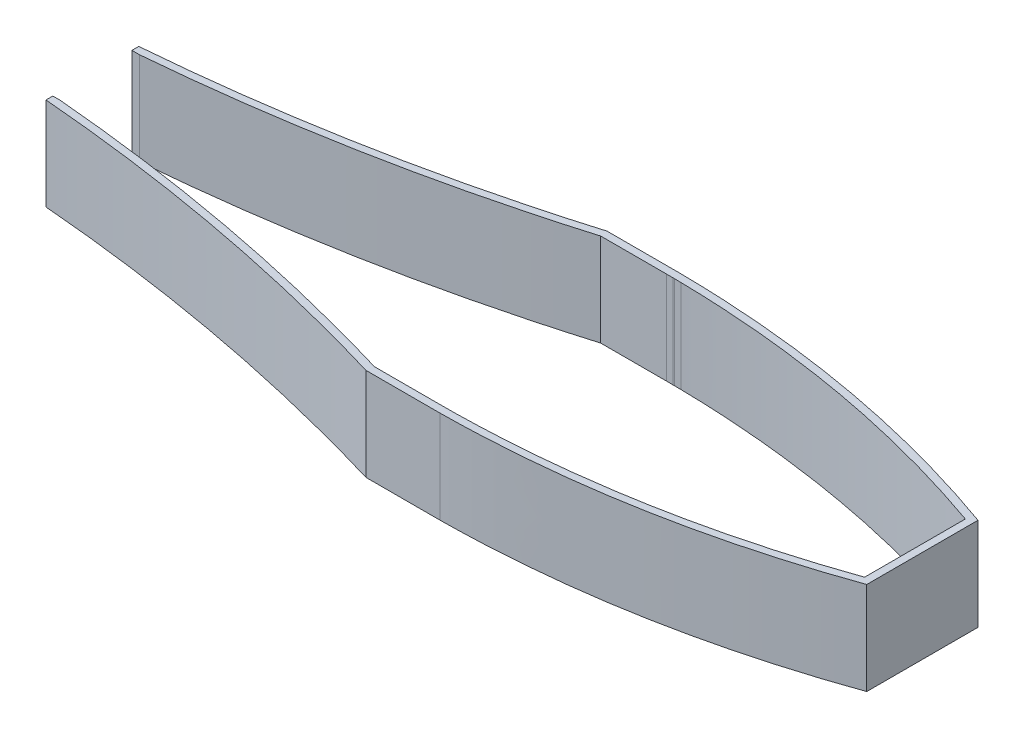
ISO-10303-21;
HEADER;
FILE_DESCRIPTION(('STEP AP214'),'2;1');
FILE_NAME('part.step','',(''),(''),'','','');
FILE_SCHEMA(('AUTOMOTIVE_DESIGN { 1 0 10303 214 1 1 1 1 }'));
ENDSEC;
DATA;
#1=APPLICATION_CONTEXT('core data for automotive mechanical design processes');
#2=APPLICATION_PROTOCOL_DEFINITION('international standard','automotive_design',2000,#1);
#3=PRODUCT_CONTEXT('',#1,'mechanical');
#4=PRODUCT('Part','Part','',(#3));
#5=PRODUCT_RELATED_PRODUCT_CATEGORY('part','',(#4));
#6=PRODUCT_DEFINITION_FORMATION('','',#4);
#7=PRODUCT_DEFINITION_CONTEXT('part definition',#1,'design');
#8=PRODUCT_DEFINITION('design','',#6,#7);
#9=PRODUCT_DEFINITION_SHAPE('','',#8);
#10=(LENGTH_UNIT() NAMED_UNIT(*) SI_UNIT(.MILLI.,.METRE.));
#11=(NAMED_UNIT(*) PLANE_ANGLE_UNIT() SI_UNIT($,.RADIAN.));
#12=(NAMED_UNIT(*) SI_UNIT($,.STERADIAN.) SOLID_ANGLE_UNIT());
#13=UNCERTAINTY_MEASURE_WITH_UNIT(LENGTH_MEASURE(1.E-05),#10,'distance_accuracy_value','');
#14=(GEOMETRIC_REPRESENTATION_CONTEXT(3) GLOBAL_UNCERTAINTY_ASSIGNED_CONTEXT((#13)) GLOBAL_UNIT_ASSIGNED_CONTEXT((#10,
#11,#12)) REPRESENTATION_CONTEXT('',''));
#15=CARTESIAN_POINT('',(0.,0.,0.));
#16=DIRECTION('',(0.,0.,1.));
#17=DIRECTION('',(1.,0.,0.));
#18=AXIS2_PLACEMENT_3D('',#15,#16,#17);
#19=CARTESIAN_POINT('',(-126.25,-12.5,0.));
#20=DIRECTION('',(1.,0.,0.));
#21=DIRECTION('',(0.,0.,-1.));
#22=AXIS2_PLACEMENT_3D('',#19,#20,#21);
#23=PLANE('',#22);
#24=DIRECTION('',(0.,0.,-1.));
#25=VECTOR('',#24,1.);
#26=CARTESIAN_POINT('',(-126.25,-12.5,0.));
#27=LINE('',#26,#25);
#28=CARTESIAN_POINT('',(-126.25,-12.5,-10.6620215750274));
#29=VERTEX_POINT('',#28);
#30=CARTESIAN_POINT('',(-126.25,-12.5,-12.5));
#31=VERTEX_POINT('',#30);
#32=EDGE_CURVE('E217',#29,#31,#27,.T.);
#33=ORIENTED_EDGE('',*,*,#32,.F.);
#34=DIRECTION('',(0.,1.,0.));
#35=VECTOR('',#34,1.);
#36=CARTESIAN_POINT('',(-126.25,-12.5,-10.6620215750274));
#37=LINE('',#36,#35);
#38=CARTESIAN_POINT('',(-126.25,12.5,-10.6620215750274));
#39=VERTEX_POINT('',#38);
#40=EDGE_CURVE('E201',#29,#39,#37,.T.);
#41=ORIENTED_EDGE('',*,*,#40,.T.);
#42=DIRECTION('',(0.,0.,-1.));
#43=VECTOR('',#42,1.);
#44=CARTESIAN_POINT('',(-126.25,12.5,0.));
#45=LINE('',#44,#43);
#46=CARTESIAN_POINT('',(-126.25,12.5,-12.5));
#47=VERTEX_POINT('',#46);
#48=EDGE_CURVE('E437',#39,#47,#45,.T.);
#49=ORIENTED_EDGE('',*,*,#48,.T.);
#50=DIRECTION('',(0.,1.,0.));
#51=VECTOR('',#50,1.);
#52=CARTESIAN_POINT('',(-126.25,-12.5,-12.5));
#53=LINE('',#52,#51);
#54=EDGE_CURVE('E224',#31,#47,#53,.T.);
#55=ORIENTED_EDGE('',*,*,#54,.F.);
#56=EDGE_LOOP('',(#33,#41,#49,#55));
#57=FACE_BOUND('',#56,.T.);
#58=ADVANCED_FACE('F35',(#57),#23,.F.);
#59=CARTESIAN_POINT('',(0.,12.5,0.));
#60=DIRECTION('',(0.,1.,0.));
#61=DIRECTION('',(0.,0.,1.));
#62=AXIS2_PLACEMENT_3D('',#59,#60,#61);
#63=PLANE('',#62);
#64=DIRECTION('',(-1.,0.,0.));
#65=VECTOR('',#64,1.);
#66=CARTESIAN_POINT('',(-126.25,12.5,-10.6620215750274));
#67=LINE('',#66,#65);
#68=CARTESIAN_POINT('',(-124.25,12.5,-10.6620215750274));
#69=VERTEX_POINT('',#68);
#70=EDGE_CURVE('E207',#69,#39,#67,.T.);
#71=ORIENTED_EDGE('',*,*,#70,.F.);
#72=CARTESIAN_POINT('',(-124.25,12.5,-10.6620215750274));
#73=CARTESIAN_POINT('',(-115.390155067907,12.5,-11.4268576003619));
#74=CARTESIAN_POINT('',(-97.6864852297956,12.5,-13.4055449764967));
#75=CARTESIAN_POINT('',(-71.4331214223826,12.5,-17.7000760163041));
#76=CARTESIAN_POINT('',(-45.4314100475332,12.5,-23.3215801554135));
#77=CARTESIAN_POINT('',(-28.2330739267644,12.5,-27.9659837794386));
#78=CARTESIAN_POINT('',(-19.7087432440609,12.5,-30.5000000000002));
#79=B_SPLINE_CURVE_WITH_KNOTS('',3,(#72,#73,#74,#75,#76,#77,#78),.UNSPECIFIED.,.F.,.F.,(4,1,1,1,
4),(0.0168781100863478,0.261989852456643,0.507101594826939,0.752213337197234,0.997325079567529),.UNSPECIFIED.);
#80=CARTESIAN_POINT('',(-19.7087432440609,12.5,-30.5000000000002));
#81=VERTEX_POINT('',#80);
#82=EDGE_CURVE('E444',#69,#81,#79,.T.);
#83=ORIENTED_EDGE('',*,*,#82,.T.);
#84=DIRECTION('',(-1.,0.,0.));
#85=VECTOR('',#84,1.);
#86=CARTESIAN_POINT('',(2.62920849060436E-13,12.5,-30.5));
#87=LINE('',#86,#85);
#88=CARTESIAN_POINT('',(-2.,12.5,-30.5));
#89=VERTEX_POINT('',#88);
#90=EDGE_CURVE('E321',#89,#81,#87,.T.);
#91=ORIENTED_EDGE('',*,*,#90,.F.);
#92=DIRECTION('',(-0.999975816566454,0.,-0.00695458713752587));
#93=VECTOR('',#92,1.);
#94=CARTESIAN_POINT('',(2.,12.5,-30.4721809786904));
#95=LINE('',#94,#93);
#96=CARTESIAN_POINT('',(-0.193723572850844,12.5,-30.4874377893955));
#97=VERTEX_POINT('',#96);
#98=EDGE_CURVE('E462',#97,#89,#95,.T.);
#99=ORIENTED_EDGE('',*,*,#98,.F.);
#100=CARTESIAN_POINT('',(0.,12.5,-29.));
#101=DIRECTION('',(0.,1.,0.));
#102=DIRECTION('',(0.,0.,1.));
#103=AXIS2_PLACEMENT_3D('',#100,#101,#102);
#104=CIRCLE('',#103,1.5);
#105=CARTESIAN_POINT('',(0.21439336457702,12.5,-30.4845994359508));
#106=VERTEX_POINT('',#105);
#107=EDGE_CURVE('E329',#106,#97,#104,.T.);
#108=ORIENTED_EDGE('',*,*,#107,.F.);
#109=CARTESIAN_POINT('',(2.,12.5,-30.4721809786904));
#110=VERTEX_POINT('',#109);
#111=EDGE_CURVE('E478',#110,#106,#95,.T.);
#112=ORIENTED_EDGE('',*,*,#111,.F.);
#113=CARTESIAN_POINT('',(95.5,12.5,-13.5862789648943));
#114=CARTESIAN_POINT('',(91.704019985039,12.5,-14.9201112795228));
#115=CARTESIAN_POINT('',(84.0400355662773,12.5,-17.4466985186937));
#116=CARTESIAN_POINT('',(68.6811540351843,12.5,-21.8452889926134));
#117=CARTESIAN_POINT('',(49.3064036307917,12.5,-26.1584186743587));
#118=CARTESIAN_POINT('',(29.7202596468768,12.5,-28.8815162857712));
#119=CARTESIAN_POINT('',(13.9286149772672,12.5,-30.1079164427287));
#120=CARTESIAN_POINT('',(5.97342158088553,12.5,-30.4038510627313));
#121=CARTESIAN_POINT('',(2.,12.5,-30.4721809786904));
#122=B_SPLINE_CURVE_WITH_KNOTS('',3,(#113,#114,#115,#116,#117,#118,#119,#120,#121),
.UNSPECIFIED.,.F.,.F.,(4,1,1,1,1,1,4),(0.0140296538795126,0.13472502987988,0.255420405880247,
0.496811157880981,0.738201909881715,0.858897285882082,0.979592661882449),.UNSPECIFIED.);
#123=CARTESIAN_POINT('',(95.5,12.5,-13.5862789648943));
#124=VERTEX_POINT('',#123);
#125=EDGE_CURVE('E288',#124,#110,#122,.T.);
#126=ORIENTED_EDGE('',*,*,#125,.F.);
#127=DIRECTION('',(0.,0.,-1.));
#128=VECTOR('',#127,1.);
#129=CARTESIAN_POINT('',(95.5,12.5,0.));
#130=LINE('',#129,#128);
#131=CARTESIAN_POINT('',(95.5,12.5,13.5862789648943));
#132=VERTEX_POINT('',#131);
#133=EDGE_CURVE('E295',#132,#124,#130,.T.);
#134=ORIENTED_EDGE('',*,*,#133,.F.);
#135=CARTESIAN_POINT('',(95.5,12.5,13.5862789648943));
#136=CARTESIAN_POINT('',(91.704019985039,12.5,14.9201112795228));
#137=CARTESIAN_POINT('',(84.0400355662773,12.5,17.4466985186937));
#138=CARTESIAN_POINT('',(68.6811540351843,12.5,21.8452889926134));
#139=CARTESIAN_POINT('',(49.3064036307917,12.5,26.1584186743587));
#140=CARTESIAN_POINT('',(29.7202596468768,12.5,28.8815162857712));
#141=CARTESIAN_POINT('',(13.9286149772672,12.5,30.1079164427287));
#142=CARTESIAN_POINT('',(5.97342158088553,12.5,30.4038510627313));
#143=CARTESIAN_POINT('',(2.,12.5,30.4721809786904));
#144=B_SPLINE_CURVE_WITH_KNOTS('',3,(#135,#136,#137,#138,#139,#140,#141,#142,#143),
.UNSPECIFIED.,.F.,.F.,(4,1,1,1,1,1,4),(0.0140296538795126,0.13472502987988,0.255420405880247,
0.496811157880981,0.738201909881715,0.858897285882082,0.979592661882449),.UNSPECIFIED.);
#145=CARTESIAN_POINT('',(2.,12.5,30.4721809786904));
#146=VERTEX_POINT('',#145);
#147=EDGE_CURVE('E414',#132,#146,#144,.T.);
#148=ORIENTED_EDGE('',*,*,#147,.T.);
#149=DIRECTION('',(-0.999975816566454,0.,0.00695458713752587));
#150=VECTOR('',#149,1.);
#151=CARTESIAN_POINT('',(2.,12.5,30.4721809786904));
#152=LINE('',#151,#150);
#153=CARTESIAN_POINT('',(0.,12.5,30.4860904893452));
#154=VERTEX_POINT('',#153);
#155=EDGE_CURVE('E664',#146,#154,#152,.T.);
#156=ORIENTED_EDGE('',*,*,#155,.T.);
#157=DIRECTION('',(0.,0.,1.));
#158=VECTOR('',#157,1.);
#159=CARTESIAN_POINT('',(0.,12.5,0.));
#160=LINE('',#159,#158);
#161=CARTESIAN_POINT('',(0.,12.5,30.5));
#162=VERTEX_POINT('',#161);
#163=EDGE_CURVE('E397',#154,#162,#160,.T.);
#164=ORIENTED_EDGE('',*,*,#163,.T.);
#165=CARTESIAN_POINT('',(0.,12.5,29.));
#166=DIRECTION('',(0.,-1.,0.));
#167=DIRECTION('',(0.,0.,-1.));
#168=AXIS2_PLACEMENT_3D('',#165,#166,#167);
#169=CIRCLE('',#168,1.5);
#170=CARTESIAN_POINT('',(-0.193723572850844,12.5,30.4874377893955));
#171=VERTEX_POINT('',#170);
#172=EDGE_CURVE('E493',#162,#171,#169,.T.);
#173=ORIENTED_EDGE('',*,*,#172,.T.);
#174=CARTESIAN_POINT('',(-2.,12.5,30.5));
#175=VERTEX_POINT('',#174);
#176=EDGE_CURVE('E59',#171,#175,#152,.T.);
#177=ORIENTED_EDGE('',*,*,#176,.T.);
#178=DIRECTION('',(-1.,0.,0.));
#179=VECTOR('',#178,1.);
#180=CARTESIAN_POINT('',(2.62920849060436E-13,12.5,30.5));
#181=LINE('',#180,#179);
#182=CARTESIAN_POINT('',(-19.7087432440609,12.5,30.5000000000002));
#183=VERTEX_POINT('',#182);
#184=EDGE_CURVE('E501',#175,#183,#181,.T.);
#185=ORIENTED_EDGE('',*,*,#184,.T.);
#186=CARTESIAN_POINT('',(-124.25,12.5,10.6620215750274));
#187=CARTESIAN_POINT('',(-115.390155067907,12.5,11.4268576003619));
#188=CARTESIAN_POINT('',(-97.6864852297956,12.5,13.4055449764967));
#189=CARTESIAN_POINT('',(-71.4331214223826,12.5,17.7000760163041));
#190=CARTESIAN_POINT('',(-45.4314100475332,12.5,23.3215801554135));
#191=CARTESIAN_POINT('',(-28.2330739267644,12.5,27.9659837794386));
#192=CARTESIAN_POINT('',(-19.7087432440609,12.5,30.5000000000002));
#193=B_SPLINE_CURVE_WITH_KNOTS('',3,(#186,#187,#188,#189,#190,#191,#192),.UNSPECIFIED.,.F.,.F.,
(4,1,1,1,4),(0.0168781100863478,0.261989852456643,0.507101594826939,0.752213337197234,
0.997325079567529),.UNSPECIFIED.);
#194=CARTESIAN_POINT('',(-124.25,12.5,10.6620215750274));
#195=VERTEX_POINT('',#194);
#196=EDGE_CURVE('E507',#195,#183,#193,.T.);
#197=ORIENTED_EDGE('',*,*,#196,.F.);
#198=DIRECTION('',(1.,0.,0.));
#199=VECTOR('',#198,1.);
#200=CARTESIAN_POINT('',(-124.25,12.5,10.6620215750274));
#201=LINE('',#200,#199);
#202=CARTESIAN_POINT('',(-126.25,12.5,10.6620215750274));
#203=VERTEX_POINT('',#202);
#204=EDGE_CURVE('E221',#203,#195,#201,.T.);
#205=ORIENTED_EDGE('',*,*,#204,.F.);
#206=CARTESIAN_POINT('',(-126.25,12.5,12.5));
#207=VERTEX_POINT('',#206);
#208=EDGE_CURVE('E438',#207,#203,#45,.T.);
#209=ORIENTED_EDGE('',*,*,#208,.F.);
#210=CARTESIAN_POINT('',(-126.25,12.5,12.5));
#211=CARTESIAN_POINT('',(-72.079745638654,12.5,16.9871695741156));
#212=CARTESIAN_POINT('',(-20.,12.5,32.5));
#213=B_SPLINE_CURVE_WITH_KNOTS('',2,(#210,#211,#212),.UNSPECIFIED.,.F.,.F.,(3,3),(0.,1.),.UNSPECIFIED.);
#214=CARTESIAN_POINT('',(-20.,12.5,32.5));
#215=VERTEX_POINT('',#214);
#216=EDGE_CURVE('E496',#207,#215,#213,.T.);
#217=ORIENTED_EDGE('',*,*,#216,.T.);
#218=DIRECTION('',(-1.,0.,0.));
#219=VECTOR('',#218,1.);
#220=CARTESIAN_POINT('',(0.,12.5,32.5));
#221=LINE('',#220,#219);
#222=CARTESIAN_POINT('',(0.,12.5,32.5));
#223=VERTEX_POINT('',#222);
#224=EDGE_CURVE('E490',#223,#215,#221,.T.);
#225=ORIENTED_EDGE('',*,*,#224,.F.);
#226=CARTESIAN_POINT('',(97.5,12.5,15.));
#227=CARTESIAN_POINT('',(49.8673330339721,12.5,31.9790963482648));
#228=CARTESIAN_POINT('',(0.,12.5,32.5));
#229=B_SPLINE_CURVE_WITH_KNOTS('',2,(#226,#227,#228),.UNSPECIFIED.,.F.,.F.,(3,3),(0.,1.),.UNSPECIFIED.);
#230=CARTESIAN_POINT('',(97.5,12.5,15.));
#231=VERTEX_POINT('',#230);
#232=EDGE_CURVE('E356',#231,#223,#229,.T.);
#233=ORIENTED_EDGE('',*,*,#232,.F.);
#234=DIRECTION('',(0.,0.,-1.));
#235=VECTOR('',#234,1.);
#236=CARTESIAN_POINT('',(97.5,12.5,0.));
#237=LINE('',#236,#235);
#238=CARTESIAN_POINT('',(97.5,12.5,-15.));
#239=VERTEX_POINT('',#238);
#240=EDGE_CURVE('E296',#231,#239,#237,.T.);
#241=ORIENTED_EDGE('',*,*,#240,.T.);
#242=CARTESIAN_POINT('',(97.5,12.5,-15.));
#243=CARTESIAN_POINT('',(49.8673330339721,12.5,-31.9790963482648));
#244=CARTESIAN_POINT('',(0.,12.5,-32.5));
#245=B_SPLINE_CURVE_WITH_KNOTS('',2,(#242,#243,#244),.UNSPECIFIED.,.F.,.F.,(3,3),(0.,1.),.UNSPECIFIED.);
#246=CARTESIAN_POINT('',(0.,12.5,-32.5));
#247=VERTEX_POINT('',#246);
#248=EDGE_CURVE('E347',#239,#247,#245,.T.);
#249=ORIENTED_EDGE('',*,*,#248,.T.);
#250=DIRECTION('',(-1.,0.,0.));
#251=VECTOR('',#250,1.);
#252=CARTESIAN_POINT('',(0.,12.5,-32.5));
#253=LINE('',#252,#251);
#254=CARTESIAN_POINT('',(-20.,12.5,-32.5));
#255=VERTEX_POINT('',#254);
#256=EDGE_CURVE('E312',#247,#255,#253,.T.);
#257=ORIENTED_EDGE('',*,*,#256,.T.);
#258=CARTESIAN_POINT('',(-126.25,12.5,-12.5));
#259=CARTESIAN_POINT('',(-72.079745638654,12.5,-16.9871695741156));
#260=CARTESIAN_POINT('',(-20.,12.5,-32.5));
#261=B_SPLINE_CURVE_WITH_KNOTS('',2,(#258,#259,#260),.UNSPECIFIED.,.F.,.F.,(3,3),(0.,1.),.UNSPECIFIED.);
#262=EDGE_CURVE('E432',#47,#255,#261,.T.);
#263=ORIENTED_EDGE('',*,*,#262,.F.);
#264=ORIENTED_EDGE('',*,*,#48,.F.);
#265=EDGE_LOOP('',(#71,#83,#91,#99,#108,#112,#126,#134,#148,#156,#164,#173,#177,#185,#197,#205,
#209,#217,#225,#233,#241,#249,#257,#263,#264));
#266=FACE_BOUND('',#265,.T.);
#267=ADVANCED_FACE('F275',(#266),#63,.T.);
#268=CARTESIAN_POINT('',(0.,-12.5,0.));
#269=DIRECTION('',(0.,1.,0.));
#270=DIRECTION('',(0.,0.,1.));
#271=AXIS2_PLACEMENT_3D('',#268,#269,#270);
#272=PLANE('',#271);
#273=CARTESIAN_POINT('',(-124.25,-12.5,-10.6620215750274));
#274=CARTESIAN_POINT('',(-115.390155067907,-12.5,-11.4268576003619));
#275=CARTESIAN_POINT('',(-97.6864852297956,-12.5,-13.4055449764967));
#276=CARTESIAN_POINT('',(-71.4331214223826,-12.5,-17.7000760163041));
#277=CARTESIAN_POINT('',(-45.4314100475332,-12.5,-23.3215801554135));
#278=CARTESIAN_POINT('',(-28.2330739267644,-12.5,-27.9659837794386));
#279=CARTESIAN_POINT('',(-19.7087432440609,-12.5,-30.5000000000002));
#280=B_SPLINE_CURVE_WITH_KNOTS('',3,(#273,#274,#275,#276,#277,#278,#279),.UNSPECIFIED.,.F.,.F.,
(4,1,1,1,4),(0.0168781100863478,0.261989852456643,0.507101594826939,0.752213337197234,
0.997325079567529),.UNSPECIFIED.);
#281=CARTESIAN_POINT('',(-124.25,-12.5,-10.6620215750274));
#282=VERTEX_POINT('',#281);
#283=CARTESIAN_POINT('',(-19.7087432440609,-12.5,-30.5000000000002));
#284=VERTEX_POINT('',#283);
#285=EDGE_CURVE('E220',#282,#284,#280,.T.);
#286=ORIENTED_EDGE('',*,*,#285,.F.);
#287=DIRECTION('',(-1.,0.,0.));
#288=VECTOR('',#287,1.);
#289=CARTESIAN_POINT('',(-126.25,-12.5,-10.6620215750274));
#290=LINE('',#289,#288);
#291=EDGE_CURVE('E204',#282,#29,#290,.T.);
#292=ORIENTED_EDGE('',*,*,#291,.T.);
#293=ORIENTED_EDGE('',*,*,#32,.T.);
#294=CARTESIAN_POINT('',(-126.25,-12.5,-12.5));
#295=CARTESIAN_POINT('',(-72.079745638654,-12.5,-16.9871695741156));
#296=CARTESIAN_POINT('',(-20.,-12.5,-32.5));
#297=B_SPLINE_CURVE_WITH_KNOTS('',2,(#294,#295,#296),.UNSPECIFIED.,.F.,.F.,(3,3),(0.,1.),.UNSPECIFIED.);
#298=CARTESIAN_POINT('',(-20.,-12.5,-32.5));
#299=VERTEX_POINT('',#298);
#300=EDGE_CURVE('E227',#31,#299,#297,.T.);
#301=ORIENTED_EDGE('',*,*,#300,.T.);
#302=DIRECTION('',(-1.,0.,0.));
#303=VECTOR('',#302,1.);
#304=CARTESIAN_POINT('',(0.,-12.5,-32.5));
#305=LINE('',#304,#303);
#306=CARTESIAN_POINT('',(0.,-12.5,-32.5));
#307=VERTEX_POINT('',#306);
#308=EDGE_CURVE('E230',#307,#299,#305,.T.);
#309=ORIENTED_EDGE('',*,*,#308,.F.);
#310=CARTESIAN_POINT('',(97.5,-12.5,-15.));
#311=CARTESIAN_POINT('',(49.8673330339721,-12.5,-31.9790963482648));
#312=CARTESIAN_POINT('',(0.,-12.5,-32.5));
#313=B_SPLINE_CURVE_WITH_KNOTS('',2,(#310,#311,#312),.UNSPECIFIED.,.F.,.F.,(3,3),(0.,1.),.UNSPECIFIED.);
#314=CARTESIAN_POINT('',(97.5,-12.5,-15.));
#315=VERTEX_POINT('',#314);
#316=EDGE_CURVE('E318',#315,#307,#313,.T.);
#317=ORIENTED_EDGE('',*,*,#316,.F.);
#318=DIRECTION('',(0.,0.,-1.));
#319=VECTOR('',#318,1.);
#320=CARTESIAN_POINT('',(97.5,-12.5,0.));
#321=LINE('',#320,#319);
#322=CARTESIAN_POINT('',(97.5,-12.5,15.));
#323=VERTEX_POINT('',#322);
#324=EDGE_CURVE('E323',#323,#315,#321,.T.);
#325=ORIENTED_EDGE('',*,*,#324,.F.);
#326=CARTESIAN_POINT('',(97.5,-12.5,15.));
#327=CARTESIAN_POINT('',(49.8673330339721,-12.5,31.9790963482648));
#328=CARTESIAN_POINT('',(0.,-12.5,32.5));
#329=B_SPLINE_CURVE_WITH_KNOTS('',2,(#326,#327,#328),.UNSPECIFIED.,.F.,.F.,(3,3),(0.,1.),.UNSPECIFIED.);
#330=CARTESIAN_POINT('',(0.,-12.5,32.5));
#331=VERTEX_POINT('',#330);
#332=EDGE_CURVE('E363',#323,#331,#329,.T.);
#333=ORIENTED_EDGE('',*,*,#332,.T.);
#334=DIRECTION('',(-1.,0.,0.));
#335=VECTOR('',#334,1.);
#336=CARTESIAN_POINT('',(0.,-12.5,32.5));
#337=LINE('',#336,#335);
#338=CARTESIAN_POINT('',(-20.,-12.5,32.5));
#339=VERTEX_POINT('',#338);
#340=EDGE_CURVE('E365',#331,#339,#337,.T.);
#341=ORIENTED_EDGE('',*,*,#340,.T.);
#342=CARTESIAN_POINT('',(-126.25,-12.5,12.5));
#343=CARTESIAN_POINT('',(-72.079745638654,-12.5,16.9871695741156));
#344=CARTESIAN_POINT('',(-20.,-12.5,32.5));
#345=B_SPLINE_CURVE_WITH_KNOTS('',2,(#342,#343,#344),.UNSPECIFIED.,.F.,.F.,(3,3),(0.,1.),.UNSPECIFIED.);
#346=CARTESIAN_POINT('',(-126.25,-12.5,12.5));
#347=VERTEX_POINT('',#346);
#348=EDGE_CURVE('E519',#347,#339,#345,.T.);
#349=ORIENTED_EDGE('',*,*,#348,.F.);
#350=CARTESIAN_POINT('',(-126.25,-12.5,10.6620215750274));
#351=VERTEX_POINT('',#350);
#352=EDGE_CURVE('E226',#347,#351,#27,.T.);
#353=ORIENTED_EDGE('',*,*,#352,.T.);
#354=DIRECTION('',(1.,0.,0.));
#355=VECTOR('',#354,1.);
#356=CARTESIAN_POINT('',(-124.25,-12.5,10.6620215750274));
#357=LINE('',#356,#355);
#358=CARTESIAN_POINT('',(-124.25,-12.5,10.6620215750274));
#359=VERTEX_POINT('',#358);
#360=EDGE_CURVE('E212',#351,#359,#357,.T.);
#361=ORIENTED_EDGE('',*,*,#360,.T.);
#362=CARTESIAN_POINT('',(-124.25,-12.5,10.6620215750274));
#363=CARTESIAN_POINT('',(-115.390155067907,-12.5,11.4268576003619));
#364=CARTESIAN_POINT('',(-97.6864852297956,-12.5,13.4055449764967));
#365=CARTESIAN_POINT('',(-71.4331214223826,-12.5,17.7000760163041));
#366=CARTESIAN_POINT('',(-45.4314100475332,-12.5,23.3215801554135));
#367=CARTESIAN_POINT('',(-28.2330739267644,-12.5,27.9659837794386));
#368=CARTESIAN_POINT('',(-19.7087432440609,-12.5,30.5000000000002));
#369=B_SPLINE_CURVE_WITH_KNOTS('',3,(#362,#363,#364,#365,#366,#367,#368),.UNSPECIFIED.,.F.,.F.,
(4,1,1,1,4),(0.0168781100863478,0.261989852456643,0.507101594826939,0.752213337197234,
0.997325079567529),.UNSPECIFIED.);
#370=CARTESIAN_POINT('',(-19.7087432440609,-12.5,30.5000000000002));
#371=VERTEX_POINT('',#370);
#372=EDGE_CURVE('E637',#359,#371,#369,.T.);
#373=ORIENTED_EDGE('',*,*,#372,.T.);
#374=DIRECTION('',(-1.,0.,0.));
#375=VECTOR('',#374,1.);
#376=CARTESIAN_POINT('',(2.62920849060436E-13,-12.5,30.5));
#377=LINE('',#376,#375);
#378=CARTESIAN_POINT('',(-2.,-12.5,30.5));
#379=VERTEX_POINT('',#378);
#380=EDGE_CURVE('E525',#379,#371,#377,.T.);
#381=ORIENTED_EDGE('',*,*,#380,.F.);
#382=DIRECTION('',(-0.999975816566454,0.,0.00695458713752587));
#383=VECTOR('',#382,1.);
#384=CARTESIAN_POINT('',(2.,-12.5,30.4721809786904));
#385=LINE('',#384,#383);
#386=CARTESIAN_POINT('',(-0.193723572850844,-12.5,30.4874377893955));
#387=VERTEX_POINT('',#386);
#388=EDGE_CURVE('E661',#387,#379,#385,.T.);
#389=ORIENTED_EDGE('',*,*,#388,.F.);
#390=CARTESIAN_POINT('',(0.,-12.5,29.));
#391=DIRECTION('',(0.,-1.,0.));
#392=DIRECTION('',(0.,0.,-1.));
#393=AXIS2_PLACEMENT_3D('',#390,#391,#392);
#394=CIRCLE('',#393,1.5);
#395=CARTESIAN_POINT('',(0.,-12.5,30.5));
#396=VERTEX_POINT('',#395);
#397=EDGE_CURVE('E516',#396,#387,#394,.T.);
#398=ORIENTED_EDGE('',*,*,#397,.F.);
#399=DIRECTION('',(0.,0.,1.));
#400=VECTOR('',#399,1.);
#401=CARTESIAN_POINT('',(0.,-12.5,0.));
#402=LINE('',#401,#400);
#403=CARTESIAN_POINT('',(0.,-12.5,30.4860904893452));
#404=VERTEX_POINT('',#403);
#405=EDGE_CURVE('E369',#404,#396,#402,.T.);
#406=ORIENTED_EDGE('',*,*,#405,.F.);
#407=CARTESIAN_POINT('',(2.,-12.5,30.4721809786904));
#408=VERTEX_POINT('',#407);
#409=EDGE_CURVE('E51',#408,#404,#385,.T.);
#410=ORIENTED_EDGE('',*,*,#409,.F.);
#411=CARTESIAN_POINT('',(95.5,-12.5,13.5862789648943));
#412=CARTESIAN_POINT('',(91.704019985039,-12.5,14.9201112795228));
#413=CARTESIAN_POINT('',(84.0400355662773,-12.5,17.4466985186937));
#414=CARTESIAN_POINT('',(68.6811540351843,-12.5,21.8452889926134));
#415=CARTESIAN_POINT('',(49.3064036307917,-12.5,26.1584186743587));
#416=CARTESIAN_POINT('',(29.7202596468768,-12.5,28.8815162857712));
#417=CARTESIAN_POINT('',(13.9286149772672,-12.5,30.1079164427287));
#418=CARTESIAN_POINT('',(5.97342158088553,-12.5,30.4038510627313));
#419=CARTESIAN_POINT('',(2.,-12.5,30.4721809786904));
#420=B_SPLINE_CURVE_WITH_KNOTS('',3,(#411,#412,#413,#414,#415,#416,#417,#418,#419),
.UNSPECIFIED.,.F.,.F.,(4,1,1,1,1,1,4),(0.0140296538795126,0.13472502987988,0.255420405880247,
0.496811157880981,0.738201909881715,0.858897285882082,0.979592661882449),.UNSPECIFIED.);
#421=CARTESIAN_POINT('',(95.5,-12.5,13.5862789648943));
#422=VERTEX_POINT('',#421);
#423=EDGE_CURVE('E372',#422,#408,#420,.T.);
#424=ORIENTED_EDGE('',*,*,#423,.F.);
#425=DIRECTION('',(0.,0.,-1.));
#426=VECTOR('',#425,1.);
#427=CARTESIAN_POINT('',(95.5,-12.5,0.));
#428=LINE('',#427,#426);
#429=CARTESIAN_POINT('',(95.5,-12.5,-13.5862789648943));
#430=VERTEX_POINT('',#429);
#431=EDGE_CURVE('E342',#422,#430,#428,.T.);
#432=ORIENTED_EDGE('',*,*,#431,.T.);
#433=CARTESIAN_POINT('',(95.5,-12.5,-13.5862789648943));
#434=CARTESIAN_POINT('',(91.704019985039,-12.5,-14.9201112795228));
#435=CARTESIAN_POINT('',(84.0400355662773,-12.5,-17.4466985186937));
#436=CARTESIAN_POINT('',(68.6811540351843,-12.5,-21.8452889926134));
#437=CARTESIAN_POINT('',(49.3064036307917,-12.5,-26.1584186743587));
#438=CARTESIAN_POINT('',(29.7202596468768,-12.5,-28.8815162857712));
#439=CARTESIAN_POINT('',(13.9286149772672,-12.5,-30.1079164427287));
#440=CARTESIAN_POINT('',(5.97342158088553,-12.5,-30.4038510627313));
#441=CARTESIAN_POINT('',(2.,-12.5,-30.4721809786904));
#442=B_SPLINE_CURVE_WITH_KNOTS('',3,(#433,#434,#435,#436,#437,#438,#439,#440,#441),
.UNSPECIFIED.,.F.,.F.,(4,1,1,1,1,1,4),(0.0140296538795126,0.13472502987988,0.255420405880247,
0.496811157880981,0.738201909881715,0.858897285882082,0.979592661882449),.UNSPECIFIED.);
#443=CARTESIAN_POINT('',(2.,-12.5,-30.4721809786904));
#444=VERTEX_POINT('',#443);
#445=EDGE_CURVE('E326',#430,#444,#442,.T.);
#446=ORIENTED_EDGE('',*,*,#445,.T.);
#447=DIRECTION('',(-0.999975816566454,0.,-0.00695458713752587));
#448=VECTOR('',#447,1.);
#449=CARTESIAN_POINT('',(2.,-12.5,-30.4721809786904));
#450=LINE('',#449,#448);
#451=CARTESIAN_POINT('',(0.214393364577021,-12.5,-30.4845994359508));
#452=VERTEX_POINT('',#451);
#453=EDGE_CURVE('E477',#444,#452,#450,.T.);
#454=ORIENTED_EDGE('',*,*,#453,.T.);
#455=CARTESIAN_POINT('',(0.,-12.5,-29.));
#456=DIRECTION('',(0.,1.,0.));
#457=DIRECTION('',(0.,0.,1.));
#458=AXIS2_PLACEMENT_3D('',#455,#456,#457);
#459=CIRCLE('',#458,1.5);
#460=CARTESIAN_POINT('',(-0.193723572850844,-12.5,-30.4874377893955));
#461=VERTEX_POINT('',#460);
#462=EDGE_CURVE('E324',#452,#461,#459,.T.);
#463=ORIENTED_EDGE('',*,*,#462,.T.);
#464=CARTESIAN_POINT('',(-2.,-12.5,-30.5));
#465=VERTEX_POINT('',#464);
#466=EDGE_CURVE('E472',#461,#465,#450,.T.);
#467=ORIENTED_EDGE('',*,*,#466,.T.);
#468=DIRECTION('',(-1.,0.,0.));
#469=VECTOR('',#468,1.);
#470=CARTESIAN_POINT('',(2.62920849060436E-13,-12.5,-30.5));
#471=LINE('',#470,#469);
#472=EDGE_CURVE('E241',#465,#284,#471,.T.);
#473=ORIENTED_EDGE('',*,*,#472,.T.);
#474=EDGE_LOOP('',(#286,#292,#293,#301,#309,#317,#325,#333,#341,#349,#353,#361,#373,#381,#389,
#398,#406,#410,#424,#432,#446,#454,#463,#467,#473));
#475=FACE_BOUND('',#474,.T.);
#476=ADVANCED_FACE('F216',(#475),#272,.F.);
#477=CARTESIAN_POINT('',(0.,12.5,0.));
#478=DIRECTION('',(1.,0.,0.));
#479=DIRECTION('',(0.,0.,-1.));
#480=AXIS2_PLACEMENT_3D('',#477,#478,#479);
#481=PLANE('',#480);
#482=DIRECTION('',(0.,1.,0.));
#483=VECTOR('',#482,1.);
#484=CARTESIAN_POINT('',(0.,12.5,30.4860904893452));
#485=LINE('',#484,#483);
#486=EDGE_CURVE('E483',#404,#154,#485,.T.);
#487=ORIENTED_EDGE('',*,*,#486,.F.);
#488=ORIENTED_EDGE('',*,*,#405,.T.);
#489=DIRECTION('',(0.,1.,0.));
#490=VECTOR('',#489,1.);
#491=CARTESIAN_POINT('',(0.,-12.5,30.5));
#492=LINE('',#491,#490);
#493=EDGE_CURVE('E380',#396,#162,#492,.T.);
#494=ORIENTED_EDGE('',*,*,#493,.T.);
#495=ORIENTED_EDGE('',*,*,#163,.F.);
#496=EDGE_LOOP('',(#487,#488,#494,#495));
#497=FACE_BOUND('',#496,.T.);
#498=ADVANCED_FACE('F274',(#497),#481,.F.);
#499=CARTESIAN_POINT('',(0.,-12.5,29.));
#500=DIRECTION('',(0.,1.,0.));
#501=DIRECTION('',(0.,0.,1.));
#502=AXIS2_PLACEMENT_3D('',#499,#500,#501);
#503=CYLINDRICAL_SURFACE('',#502,1.5);
#504=ORIENTED_EDGE('',*,*,#397,.T.);
#505=DIRECTION('',(0.,1.,0.));
#506=VECTOR('',#505,1.);
#507=CARTESIAN_POINT('',(-0.193723572850845,-12.5,30.4874377893955));
#508=LINE('',#507,#506);
#509=EDGE_CURVE('E11',#387,#171,#508,.T.);
#510=ORIENTED_EDGE('',*,*,#509,.T.);
#511=ORIENTED_EDGE('',*,*,#172,.F.);
#512=ORIENTED_EDGE('',*,*,#493,.F.);
#513=EDGE_LOOP('',(#504,#510,#511,#512));
#514=FACE_BOUND('',#513,.T.);
#515=ADVANCED_FACE('F286',(#514),#503,.F.);
#516=DIRECTION('',(0.,-1.,0.));
#517=VECTOR('',#516,1.);
#518=SURFACE_OF_LINEAR_EXTRUSION('',#122,#517);
#519=DIRECTION('',(0.,-1.,0.));
#520=VECTOR('',#519,1.);
#521=CARTESIAN_POINT('',(2.,12.5,-30.4721809786904));
#522=LINE('',#521,#520);
#523=EDGE_CURVE('E303',#110,#444,#522,.T.);
#524=ORIENTED_EDGE('',*,*,#523,.T.);
#525=ORIENTED_EDGE('',*,*,#445,.F.);
#526=DIRECTION('',(0.,-1.,0.));
#527=VECTOR('',#526,1.);
#528=CARTESIAN_POINT('',(95.5,12.5,-13.5862789648943));
#529=LINE('',#528,#527);
#530=EDGE_CURVE('E44',#124,#430,#529,.T.);
#531=ORIENTED_EDGE('',*,*,#530,.F.);
#532=ORIENTED_EDGE('',*,*,#125,.T.);
#533=EDGE_LOOP('',(#524,#525,#531,#532));
#534=FACE_BOUND('',#533,.T.);
#535=ADVANCED_FACE('F282',(#534),#518,.T.);
#536=CARTESIAN_POINT('',(95.5,12.5,0.));
#537=DIRECTION('',(-1.,0.,0.));
#538=DIRECTION('',(0.,0.,1.));
#539=AXIS2_PLACEMENT_3D('',#536,#537,#538);
#540=PLANE('',#539);
#541=ORIENTED_EDGE('',*,*,#530,.T.);
#542=ORIENTED_EDGE('',*,*,#431,.F.);
#543=DIRECTION('',(0.,-1.,0.));
#544=VECTOR('',#543,1.);
#545=CARTESIAN_POINT('',(95.5,12.5,13.5862789648943));
#546=LINE('',#545,#544);
#547=EDGE_CURVE('E421',#132,#422,#546,.T.);
#548=ORIENTED_EDGE('',*,*,#547,.F.);
#549=ORIENTED_EDGE('',*,*,#133,.T.);
#550=EDGE_LOOP('',(#541,#542,#548,#549));
#551=FACE_BOUND('',#550,.T.);
#552=ADVANCED_FACE('F279',(#551),#540,.T.);
#553=DIRECTION('',(0.,-1.,0.));
#554=VECTOR('',#553,1.);
#555=SURFACE_OF_LINEAR_EXTRUSION('',#245,#554);
#556=DIRECTION('',(0.,-1.,0.));
#557=VECTOR('',#556,1.);
#558=CARTESIAN_POINT('',(97.5,12.5,-15.));
#559=LINE('',#558,#557);
#560=EDGE_CURVE('E302',#239,#315,#559,.T.);
#561=ORIENTED_EDGE('',*,*,#560,.T.);
#562=ORIENTED_EDGE('',*,*,#316,.T.);
#563=DIRECTION('',(0.,-1.,0.));
#564=VECTOR('',#563,1.);
#565=CARTESIAN_POINT('',(0.,12.5,-32.5));
#566=LINE('',#565,#564);
#567=EDGE_CURVE('E306',#247,#307,#566,.T.);
#568=ORIENTED_EDGE('',*,*,#567,.F.);
#569=ORIENTED_EDGE('',*,*,#248,.F.);
#570=EDGE_LOOP('',(#561,#562,#568,#569));
#571=FACE_BOUND('',#570,.T.);
#572=ADVANCED_FACE('F37',(#571),#555,.F.);
#573=CARTESIAN_POINT('',(97.5,12.5,0.));
#574=DIRECTION('',(-1.,0.,0.));
#575=DIRECTION('',(0.,0.,1.));
#576=AXIS2_PLACEMENT_3D('',#573,#574,#575);
#577=PLANE('',#576);
#578=ORIENTED_EDGE('',*,*,#240,.F.);
#579=DIRECTION('',(0.,-1.,0.));
#580=VECTOR('',#579,1.);
#581=CARTESIAN_POINT('',(97.5,12.5,15.));
#582=LINE('',#581,#580);
#583=EDGE_CURVE('E360',#231,#323,#582,.T.);
#584=ORIENTED_EDGE('',*,*,#583,.T.);
#585=ORIENTED_EDGE('',*,*,#324,.T.);
#586=ORIENTED_EDGE('',*,*,#560,.F.);
#587=EDGE_LOOP('',(#578,#584,#585,#586));
#588=FACE_BOUND('',#587,.T.);
#589=ADVANCED_FACE('F270',(#588),#577,.F.);
#590=CARTESIAN_POINT('',(0.,-12.5,-29.));
#591=DIRECTION('',(0.,1.,0.));
#592=DIRECTION('',(0.,0.,1.));
#593=AXIS2_PLACEMENT_3D('',#590,#591,#592);
#594=CYLINDRICAL_SURFACE('',#593,1.5);
#595=ORIENTED_EDGE('',*,*,#107,.T.);
#596=DIRECTION('',(0.,1.,0.));
#597=VECTOR('',#596,1.);
#598=CARTESIAN_POINT('',(-0.193723572850845,-12.5,-30.4874377893955));
#599=LINE('',#598,#597);
#600=EDGE_CURVE('E488',#97,#461,#599,.F.);
#601=ORIENTED_EDGE('',*,*,#600,.T.);
#602=ORIENTED_EDGE('',*,*,#462,.F.);
#603=DIRECTION('',(0.,1.,0.));
#604=VECTOR('',#603,1.);
#605=CARTESIAN_POINT('',(0.214393364577022,-12.5,-30.4845994359508));
#606=LINE('',#605,#604);
#607=EDGE_CURVE('E480',#452,#106,#606,.T.);
#608=ORIENTED_EDGE('',*,*,#607,.T.);
#609=EDGE_LOOP('',(#595,#601,#602,#608));
#610=FACE_BOUND('',#609,.T.);
#611=ADVANCED_FACE('F267',(#610),#594,.F.);
#612=CARTESIAN_POINT('',(2.62920849060436E-13,-12.5,-30.5));
#613=DIRECTION('',(0.,0.,-1.));
#614=DIRECTION('',(-1.,0.,0.));
#615=AXIS2_PLACEMENT_3D('',#612,#613,#614);
#616=PLANE('',#615);
#617=DIRECTION('',(0.,1.,0.));
#618=VECTOR('',#617,1.);
#619=CARTESIAN_POINT('',(-2.,-12.5,-30.5));
#620=LINE('',#619,#618);
#621=EDGE_CURVE('E459',#465,#89,#620,.T.);
#622=ORIENTED_EDGE('',*,*,#621,.T.);
#623=ORIENTED_EDGE('',*,*,#90,.T.);
#624=DIRECTION('',(0.,1.,0.));
#625=VECTOR('',#624,1.);
#626=CARTESIAN_POINT('',(-19.7087432440609,-12.5,-30.5000000000002));
#627=LINE('',#626,#625);
#628=EDGE_CURVE('E458',#284,#81,#627,.T.);
#629=ORIENTED_EDGE('',*,*,#628,.F.);
#630=ORIENTED_EDGE('',*,*,#472,.F.);
#631=EDGE_LOOP('',(#622,#623,#629,#630));
#632=FACE_BOUND('',#631,.T.);
#633=ADVANCED_FACE('F254',(#632),#616,.F.);
#634=CARTESIAN_POINT('',(0.,-12.5,-32.5));
#635=DIRECTION('',(0.,0.,-1.));
#636=DIRECTION('',(-1.,0.,0.));
#637=AXIS2_PLACEMENT_3D('',#634,#635,#636);
#638=PLANE('',#637);
#639=DIRECTION('',(0.,1.,0.));
#640=VECTOR('',#639,1.);
#641=CARTESIAN_POINT('',(-20.,-12.5,-32.5));
#642=LINE('',#641,#640);
#643=EDGE_CURVE('E470',#299,#255,#642,.T.);
#644=ORIENTED_EDGE('',*,*,#643,.T.);
#645=ORIENTED_EDGE('',*,*,#256,.F.);
#646=ORIENTED_EDGE('',*,*,#567,.T.);
#647=ORIENTED_EDGE('',*,*,#308,.T.);
#648=EDGE_LOOP('',(#644,#645,#646,#647));
#649=FACE_BOUND('',#648,.T.);
#650=ADVANCED_FACE('F259',(#649),#638,.T.);
#651=ORIENTED_EDGE('',*,*,#208,.T.);
#652=DIRECTION('',(0.,1.,0.));
#653=VECTOR('',#652,1.);
#654=CARTESIAN_POINT('',(-126.25,-12.5,10.6620215750274));
#655=LINE('',#654,#653);
#656=EDGE_CURVE('E211',#351,#203,#655,.T.);
#657=ORIENTED_EDGE('',*,*,#656,.F.);
#658=ORIENTED_EDGE('',*,*,#352,.F.);
#659=DIRECTION('',(0.,1.,0.));
#660=VECTOR('',#659,1.);
#661=CARTESIAN_POINT('',(-126.25,-12.5,12.5));
#662=LINE('',#661,#660);
#663=EDGE_CURVE('E649',#347,#207,#662,.T.);
#664=ORIENTED_EDGE('',*,*,#663,.T.);
#665=EDGE_LOOP('',(#651,#657,#658,#664));
#666=FACE_BOUND('',#665,.T.);
#667=ADVANCED_FACE('F256',(#666),#23,.F.);
#668=DIRECTION('',(0.,1.,0.));
#669=VECTOR('',#668,1.);
#670=SURFACE_OF_LINEAR_EXTRUSION('',#297,#669);
#671=ORIENTED_EDGE('',*,*,#54,.T.);
#672=ORIENTED_EDGE('',*,*,#262,.T.);
#673=ORIENTED_EDGE('',*,*,#643,.F.);
#674=ORIENTED_EDGE('',*,*,#300,.F.);
#675=EDGE_LOOP('',(#671,#672,#673,#674));
#676=FACE_BOUND('',#675,.T.);
#677=ADVANCED_FACE('F252',(#676),#670,.F.);
#678=DIRECTION('',(0.,1.,0.));
#679=VECTOR('',#678,1.);
#680=SURFACE_OF_LINEAR_EXTRUSION('',#280,#679);
#681=ORIENTED_EDGE('',*,*,#628,.T.);
#682=ORIENTED_EDGE('',*,*,#82,.F.);
#683=DIRECTION('',(0.,1.,0.));
#684=VECTOR('',#683,1.);
#685=CARTESIAN_POINT('',(-124.25,-12.5,-10.6620215750274));
#686=LINE('',#685,#684);
#687=EDGE_CURVE('E465',#282,#69,#686,.T.);
#688=ORIENTED_EDGE('',*,*,#687,.F.);
#689=ORIENTED_EDGE('',*,*,#285,.T.);
#690=EDGE_LOOP('',(#681,#682,#688,#689));
#691=FACE_BOUND('',#690,.T.);
#692=ADVANCED_FACE('F247',(#691),#680,.T.);
#693=DIRECTION('',(0.,-1.,0.));
#694=VECTOR('',#693,1.);
#695=SURFACE_OF_LINEAR_EXTRUSION('',#144,#694);
#696=ORIENTED_EDGE('',*,*,#547,.T.);
#697=ORIENTED_EDGE('',*,*,#423,.T.);
#698=DIRECTION('',(0.,-1.,0.));
#699=VECTOR('',#698,1.);
#700=CARTESIAN_POINT('',(2.,12.5,30.4721809786904));
#701=LINE('',#700,#699);
#702=EDGE_CURVE('E427',#146,#408,#701,.T.);
#703=ORIENTED_EDGE('',*,*,#702,.F.);
#704=ORIENTED_EDGE('',*,*,#147,.F.);
#705=EDGE_LOOP('',(#696,#697,#703,#704));
#706=FACE_BOUND('',#705,.T.);
#707=ADVANCED_FACE('F251',(#706),#695,.F.);
#708=DIRECTION('',(0.,-1.,0.));
#709=VECTOR('',#708,1.);
#710=SURFACE_OF_LINEAR_EXTRUSION('',#229,#709);
#711=DIRECTION('',(0.,-1.,0.));
#712=VECTOR('',#711,1.);
#713=CARTESIAN_POINT('',(0.,12.5,32.5));
#714=LINE('',#713,#712);
#715=EDGE_CURVE('E420',#223,#331,#714,.T.);
#716=ORIENTED_EDGE('',*,*,#715,.T.);
#717=ORIENTED_EDGE('',*,*,#332,.F.);
#718=ORIENTED_EDGE('',*,*,#583,.F.);
#719=ORIENTED_EDGE('',*,*,#232,.T.);
#720=EDGE_LOOP('',(#716,#717,#718,#719));
#721=FACE_BOUND('',#720,.T.);
#722=ADVANCED_FACE('F402',(#721),#710,.T.);
#723=DIRECTION('',(0.,1.,0.));
#724=VECTOR('',#723,1.);
#725=SURFACE_OF_LINEAR_EXTRUSION('',#369,#724);
#726=DIRECTION('',(0.,1.,0.));
#727=VECTOR('',#726,1.);
#728=CARTESIAN_POINT('',(-124.25,-12.5,10.6620215750274));
#729=LINE('',#728,#727);
#730=EDGE_CURVE('E370',#359,#195,#729,.T.);
#731=ORIENTED_EDGE('',*,*,#730,.T.);
#732=ORIENTED_EDGE('',*,*,#196,.T.);
#733=DIRECTION('',(0.,1.,0.));
#734=VECTOR('',#733,1.);
#735=CARTESIAN_POINT('',(-19.7087432440609,-12.5,30.5000000000002));
#736=LINE('',#735,#734);
#737=EDGE_CURVE('E375',#371,#183,#736,.T.);
#738=ORIENTED_EDGE('',*,*,#737,.F.);
#739=ORIENTED_EDGE('',*,*,#372,.F.);
#740=EDGE_LOOP('',(#731,#732,#738,#739));
#741=FACE_BOUND('',#740,.T.);
#742=ADVANCED_FACE('F405',(#741),#725,.F.);
#743=CARTESIAN_POINT('',(2.62920849060436E-13,-12.5,30.5));
#744=DIRECTION('',(0.,0.,-1.));
#745=DIRECTION('',(-1.,0.,0.));
#746=AXIS2_PLACEMENT_3D('',#743,#744,#745);
#747=PLANE('',#746);
#748=ORIENTED_EDGE('',*,*,#737,.T.);
#749=ORIENTED_EDGE('',*,*,#184,.F.);
#750=DIRECTION('',(0.,1.,0.));
#751=VECTOR('',#750,1.);
#752=CARTESIAN_POINT('',(-2.,-12.5,30.5));
#753=LINE('',#752,#751);
#754=EDGE_CURVE('E646',#379,#175,#753,.T.);
#755=ORIENTED_EDGE('',*,*,#754,.F.);
#756=ORIENTED_EDGE('',*,*,#380,.T.);
#757=EDGE_LOOP('',(#748,#749,#755,#756));
#758=FACE_BOUND('',#757,.T.);
#759=ADVANCED_FACE('F536',(#758),#747,.T.);
#760=CARTESIAN_POINT('',(0.,-12.5,32.5));
#761=DIRECTION('',(0.,0.,-1.));
#762=DIRECTION('',(-1.,0.,0.));
#763=AXIS2_PLACEMENT_3D('',#760,#761,#762);
#764=PLANE('',#763);
#765=ORIENTED_EDGE('',*,*,#715,.F.);
#766=ORIENTED_EDGE('',*,*,#224,.T.);
#767=DIRECTION('',(0.,1.,0.));
#768=VECTOR('',#767,1.);
#769=CARTESIAN_POINT('',(-20.,-12.5,32.5));
#770=LINE('',#769,#768);
#771=EDGE_CURVE('E648',#339,#215,#770,.T.);
#772=ORIENTED_EDGE('',*,*,#771,.F.);
#773=ORIENTED_EDGE('',*,*,#340,.F.);
#774=EDGE_LOOP('',(#765,#766,#772,#773));
#775=FACE_BOUND('',#774,.T.);
#776=ADVANCED_FACE('F412',(#775),#764,.F.);
#777=DIRECTION('',(0.,1.,0.));
#778=VECTOR('',#777,1.);
#779=SURFACE_OF_LINEAR_EXTRUSION('',#345,#778);
#780=ORIENTED_EDGE('',*,*,#771,.T.);
#781=ORIENTED_EDGE('',*,*,#216,.F.);
#782=ORIENTED_EDGE('',*,*,#663,.F.);
#783=ORIENTED_EDGE('',*,*,#348,.T.);
#784=EDGE_LOOP('',(#780,#781,#782,#783));
#785=FACE_BOUND('',#784,.T.);
#786=ADVANCED_FACE('F531',(#785),#779,.T.);
#787=CARTESIAN_POINT('',(2.,-12.5,-30.4721809786904));
#788=DIRECTION('',(0.00695458713752587,0.,-0.999975816566454));
#789=DIRECTION('',(-0.999975816566454,0.,-0.00695458713752587));
#790=AXIS2_PLACEMENT_3D('',#787,#788,#789);
#791=PLANE('',#790);
#792=ORIENTED_EDGE('',*,*,#98,.T.);
#793=ORIENTED_EDGE('',*,*,#621,.F.);
#794=ORIENTED_EDGE('',*,*,#466,.F.);
#795=ORIENTED_EDGE('',*,*,#600,.F.);
#796=EDGE_LOOP('',(#792,#793,#794,#795));
#797=FACE_BOUND('',#796,.T.);
#798=ADVANCED_FACE('F534',(#797),#791,.F.);
#799=ORIENTED_EDGE('',*,*,#453,.F.);
#800=ORIENTED_EDGE('',*,*,#523,.F.);
#801=ORIENTED_EDGE('',*,*,#111,.T.);
#802=ORIENTED_EDGE('',*,*,#607,.F.);
#803=EDGE_LOOP('',(#799,#800,#801,#802));
#804=FACE_BOUND('',#803,.T.);
#805=ADVANCED_FACE('F566',(#804),#791,.F.);
#806=CARTESIAN_POINT('',(2.,-12.5,30.4721809786904));
#807=DIRECTION('',(-0.00695458713752587,0.,-0.999975816566454));
#808=DIRECTION('',(-0.999975816566454,0.,0.00695458713752587));
#809=AXIS2_PLACEMENT_3D('',#806,#807,#808);
#810=PLANE('',#809);
#811=ORIENTED_EDGE('',*,*,#388,.T.);
#812=ORIENTED_EDGE('',*,*,#754,.T.);
#813=ORIENTED_EDGE('',*,*,#176,.F.);
#814=ORIENTED_EDGE('',*,*,#509,.F.);
#815=EDGE_LOOP('',(#811,#812,#813,#814));
#816=FACE_BOUND('',#815,.T.);
#817=ADVANCED_FACE('F595',(#816),#810,.T.);
#818=ORIENTED_EDGE('',*,*,#486,.T.);
#819=ORIENTED_EDGE('',*,*,#155,.F.);
#820=ORIENTED_EDGE('',*,*,#702,.T.);
#821=ORIENTED_EDGE('',*,*,#409,.T.);
#822=EDGE_LOOP('',(#818,#819,#820,#821));
#823=FACE_BOUND('',#822,.T.);
#824=ADVANCED_FACE('F599',(#823),#810,.T.);
#825=CARTESIAN_POINT('',(-124.25,-12.5,10.6620215750274));
#826=DIRECTION('',(0.,0.,1.));
#827=DIRECTION('',(1.,0.,0.));
#828=AXIS2_PLACEMENT_3D('',#825,#826,#827);
#829=PLANE('',#828);
#830=ORIENTED_EDGE('',*,*,#204,.T.);
#831=ORIENTED_EDGE('',*,*,#730,.F.);
#832=ORIENTED_EDGE('',*,*,#360,.F.);
#833=ORIENTED_EDGE('',*,*,#656,.T.);
#834=EDGE_LOOP('',(#830,#831,#832,#833));
#835=FACE_BOUND('',#834,.T.);
#836=ADVANCED_FACE('F607',(#835),#829,.F.);
#837=CARTESIAN_POINT('',(-126.25,-12.5,-10.6620215750274));
#838=DIRECTION('',(0.,0.,-1.));
#839=DIRECTION('',(-1.,0.,0.));
#840=AXIS2_PLACEMENT_3D('',#837,#838,#839);
#841=PLANE('',#840);
#842=ORIENTED_EDGE('',*,*,#70,.T.);
#843=ORIENTED_EDGE('',*,*,#40,.F.);
#844=ORIENTED_EDGE('',*,*,#291,.F.);
#845=ORIENTED_EDGE('',*,*,#687,.T.);
#846=EDGE_LOOP('',(#842,#843,#844,#845));
#847=FACE_BOUND('',#846,.T.);
#848=ADVANCED_FACE('F203',(#847),#841,.F.);
#849=CLOSED_SHELL('',(#58,#267,#476,#498,#515,#535,#552,#572,#589,#611,#633,#650,#667,#677,#692,
#707,#722,#742,#759,#776,#786,#798,#805,#817,#824,#836,#848));
#850=MANIFOLD_SOLID_BREP('B2',#849);
#851=ADVANCED_BREP_SHAPE_REPRESENTATION('',(#18,#850),#14);
#852=SHAPE_DEFINITION_REPRESENTATION(#9,#851);
ENDSEC;
END-ISO-10303-21;
